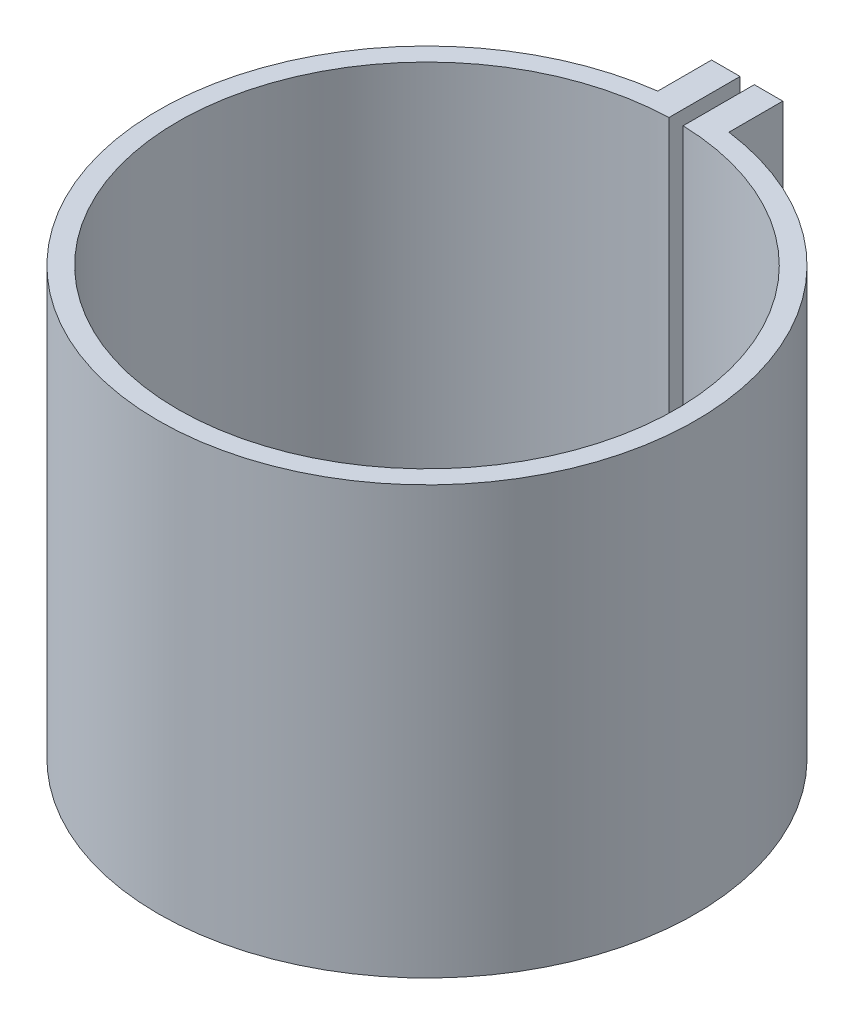
ISO-10303-21;
HEADER;
FILE_DESCRIPTION(('STEP AP214'),'2;1');
FILE_NAME('part.step','',(''),(''),'','','');
FILE_SCHEMA(('AUTOMOTIVE_DESIGN { 1 0 10303 214 1 1 1 1 }'));
ENDSEC;
DATA;
#1=APPLICATION_CONTEXT('core data for automotive mechanical design processes');
#2=APPLICATION_PROTOCOL_DEFINITION('international standard','automotive_design',2000,#1);
#3=PRODUCT_CONTEXT('',#1,'mechanical');
#4=PRODUCT('Part','Part','',(#3));
#5=PRODUCT_RELATED_PRODUCT_CATEGORY('part','',(#4));
#6=PRODUCT_DEFINITION_FORMATION('','',#4);
#7=PRODUCT_DEFINITION_CONTEXT('part definition',#1,'design');
#8=PRODUCT_DEFINITION('design','',#6,#7);
#9=PRODUCT_DEFINITION_SHAPE('','',#8);
#10=(LENGTH_UNIT() NAMED_UNIT(*) SI_UNIT(.MILLI.,.METRE.));
#11=(NAMED_UNIT(*) PLANE_ANGLE_UNIT() SI_UNIT($,.RADIAN.));
#12=(NAMED_UNIT(*) SI_UNIT($,.STERADIAN.) SOLID_ANGLE_UNIT());
#13=UNCERTAINTY_MEASURE_WITH_UNIT(LENGTH_MEASURE(1.E-05),#10,'distance_accuracy_value','');
#14=(GEOMETRIC_REPRESENTATION_CONTEXT(3) GLOBAL_UNCERTAINTY_ASSIGNED_CONTEXT((#13)) GLOBAL_UNIT_ASSIGNED_CONTEXT((#10,
#11,#12)) REPRESENTATION_CONTEXT('',''));
#15=CARTESIAN_POINT('',(0.,0.,0.));
#16=DIRECTION('',(0.,0.,1.));
#17=DIRECTION('',(1.,0.,0.));
#18=AXIS2_PLACEMENT_3D('',#15,#16,#17);
#19=CARTESIAN_POINT('',(0.,15.,0.));
#20=DIRECTION('',(0.,-1.,0.));
#21=DIRECTION('',(0.,0.,-1.));
#22=AXIS2_PLACEMENT_3D('',#19,#20,#21);
#23=CYLINDRICAL_SURFACE('',#22,17.5);
#24=CARTESIAN_POINT('',(0.,-15.,0.));
#25=DIRECTION('',(0.,-1.,0.));
#26=DIRECTION('',(0.,0.,1.));
#27=AXIS2_PLACEMENT_3D('',#24,#25,#26);
#28=CIRCLE('',#27,17.5);
#29=CARTESIAN_POINT('',(0.5,-15.,-17.4928556845359));
#30=VERTEX_POINT('',#29);
#31=CARTESIAN_POINT('',(-0.5,-15.,-17.4928556845359));
#32=VERTEX_POINT('',#31);
#33=EDGE_CURVE('E129',#30,#32,#28,.T.);
#34=ORIENTED_EDGE('',*,*,#33,.T.);
#35=DIRECTION('',(0.,-1.,0.));
#36=VECTOR('',#35,1.);
#37=CARTESIAN_POINT('',(-0.5,15.,-17.4928556845359));
#38=LINE('',#37,#36);
#39=CARTESIAN_POINT('',(-0.5,15.,-17.4928556845359));
#40=VERTEX_POINT('',#39);
#41=EDGE_CURVE('E11',#40,#32,#38,.T.);
#42=ORIENTED_EDGE('',*,*,#41,.F.);
#43=CARTESIAN_POINT('',(0.,15.,0.));
#44=DIRECTION('',(0.,-1.,0.));
#45=DIRECTION('',(0.,0.,1.));
#46=AXIS2_PLACEMENT_3D('',#43,#44,#45);
#47=CIRCLE('',#46,17.5);
#48=CARTESIAN_POINT('',(0.5,15.,-17.4928556845359));
#49=VERTEX_POINT('',#48);
#50=EDGE_CURVE('E143',#49,#40,#47,.T.);
#51=ORIENTED_EDGE('',*,*,#50,.F.);
#52=DIRECTION('',(0.,-1.,0.));
#53=VECTOR('',#52,1.);
#54=CARTESIAN_POINT('',(0.5,15.,-17.4928556845359));
#55=LINE('',#54,#53);
#56=EDGE_CURVE('E125',#49,#30,#55,.T.);
#57=ORIENTED_EDGE('',*,*,#56,.T.);
#58=EDGE_LOOP('',(#34,#42,#51,#57));
#59=FACE_BOUND('',#58,.T.);
#60=ADVANCED_FACE('F33',(#59),#23,.F.);
#61=CARTESIAN_POINT('',(-0.5,15.,-22.4928556845359));
#62=DIRECTION('',(-1.,0.,0.));
#63=DIRECTION('',(0.,0.,1.));
#64=AXIS2_PLACEMENT_3D('',#61,#62,#63);
#65=PLANE('',#64);
#66=DIRECTION('',(0.,0.,-1.));
#67=VECTOR('',#66,1.);
#68=CARTESIAN_POINT('',(-0.5,-15.,-22.4928556845359));
#69=LINE('',#68,#67);
#70=CARTESIAN_POINT('',(-0.5,-15.,-22.4928556845359));
#71=VERTEX_POINT('',#70);
#72=EDGE_CURVE('E132',#32,#71,#69,.T.);
#73=ORIENTED_EDGE('',*,*,#72,.T.);
#74=DIRECTION('',(0.,-1.,0.));
#75=VECTOR('',#74,1.);
#76=CARTESIAN_POINT('',(-0.5,15.,-22.4928556845359));
#77=LINE('',#76,#75);
#78=CARTESIAN_POINT('',(-0.5,15.,-22.4928556845359));
#79=VERTEX_POINT('',#78);
#80=EDGE_CURVE('E41',#79,#71,#77,.T.);
#81=ORIENTED_EDGE('',*,*,#80,.F.);
#82=DIRECTION('',(0.,0.,-1.));
#83=VECTOR('',#82,1.);
#84=CARTESIAN_POINT('',(-0.5,15.,-22.4928556845359));
#85=LINE('',#84,#83);
#86=EDGE_CURVE('E92',#40,#79,#85,.T.);
#87=ORIENTED_EDGE('',*,*,#86,.F.);
#88=ORIENTED_EDGE('',*,*,#41,.T.);
#89=EDGE_LOOP('',(#73,#81,#87,#88));
#90=FACE_BOUND('',#89,.T.);
#91=ADVANCED_FACE('F178',(#90),#65,.F.);
#92=CARTESIAN_POINT('',(-2.5,15.,-22.4928556845359));
#93=DIRECTION('',(0.,0.,1.));
#94=DIRECTION('',(1.,0.,0.));
#95=AXIS2_PLACEMENT_3D('',#92,#93,#94);
#96=PLANE('',#95);
#97=DIRECTION('',(-1.,0.,0.));
#98=VECTOR('',#97,1.);
#99=CARTESIAN_POINT('',(-2.5,-15.,-22.4928556845359));
#100=LINE('',#99,#98);
#101=CARTESIAN_POINT('',(-2.5,-15.,-22.4928556845359));
#102=VERTEX_POINT('',#101);
#103=EDGE_CURVE('E134',#71,#102,#100,.T.);
#104=ORIENTED_EDGE('',*,*,#103,.T.);
#105=DIRECTION('',(0.,-1.,0.));
#106=VECTOR('',#105,1.);
#107=CARTESIAN_POINT('',(-2.5,15.,-22.4928556845359));
#108=LINE('',#107,#106);
#109=CARTESIAN_POINT('',(-2.5,15.,-22.4928556845359));
#110=VERTEX_POINT('',#109);
#111=EDGE_CURVE('E150',#110,#102,#108,.T.);
#112=ORIENTED_EDGE('',*,*,#111,.F.);
#113=DIRECTION('',(-1.,0.,0.));
#114=VECTOR('',#113,1.);
#115=CARTESIAN_POINT('',(-2.5,15.,-22.4928556845359));
#116=LINE('',#115,#114);
#117=EDGE_CURVE('E158',#79,#110,#116,.T.);
#118=ORIENTED_EDGE('',*,*,#117,.F.);
#119=ORIENTED_EDGE('',*,*,#80,.T.);
#120=EDGE_LOOP('',(#104,#112,#118,#119));
#121=FACE_BOUND('',#120,.T.);
#122=ADVANCED_FACE('F156',(#121),#96,.F.);
#123=CARTESIAN_POINT('',(-2.5,15.,-22.4928556845359));
#124=DIRECTION('',(1.,0.,0.));
#125=DIRECTION('',(0.,0.,-1.));
#126=AXIS2_PLACEMENT_3D('',#123,#124,#125);
#127=PLANE('',#126);
#128=DIRECTION('',(0.,0.,1.));
#129=VECTOR('',#128,1.);
#130=CARTESIAN_POINT('',(-2.5,-15.,-22.4928556845359));
#131=LINE('',#130,#129);
#132=CARTESIAN_POINT('',(-2.49999999999999,-15.,-18.7119872578631));
#133=VERTEX_POINT('',#132);
#134=EDGE_CURVE('E136',#102,#133,#131,.T.);
#135=ORIENTED_EDGE('',*,*,#134,.T.);
#136=DIRECTION('',(0.,-1.,0.));
#137=VECTOR('',#136,1.);
#138=CARTESIAN_POINT('',(-2.49999999999999,15.,-18.7119872578631));
#139=LINE('',#138,#137);
#140=CARTESIAN_POINT('',(-2.49999999999999,15.,-18.7119872578631));
#141=VERTEX_POINT('',#140);
#142=EDGE_CURVE('E147',#141,#133,#139,.T.);
#143=ORIENTED_EDGE('',*,*,#142,.F.);
#144=DIRECTION('',(0.,0.,1.));
#145=VECTOR('',#144,1.);
#146=CARTESIAN_POINT('',(-2.5,15.,-22.4928556845359));
#147=LINE('',#146,#145);
#148=EDGE_CURVE('E170',#110,#141,#147,.T.);
#149=ORIENTED_EDGE('',*,*,#148,.F.);
#150=ORIENTED_EDGE('',*,*,#111,.T.);
#151=EDGE_LOOP('',(#135,#143,#149,#150));
#152=FACE_BOUND('',#151,.T.);
#153=ADVANCED_FACE('F166',(#152),#127,.F.);
#154=CARTESIAN_POINT('',(0.,15.,0.));
#155=DIRECTION('',(0.,-1.,0.));
#156=DIRECTION('',(0.,0.,-1.));
#157=AXIS2_PLACEMENT_3D('',#154,#155,#156);
#158=CYLINDRICAL_SURFACE('',#157,18.8782538159236);
#159=CARTESIAN_POINT('',(0.,-15.,0.));
#160=DIRECTION('',(0.,1.,0.));
#161=DIRECTION('',(0.,0.,1.));
#162=AXIS2_PLACEMENT_3D('',#159,#160,#161);
#163=CIRCLE('',#162,18.8782538159236);
#164=CARTESIAN_POINT('',(2.5,-15.,-18.7119872578631));
#165=VERTEX_POINT('',#164);
#166=EDGE_CURVE('E138',#133,#165,#163,.T.);
#167=ORIENTED_EDGE('',*,*,#166,.T.);
#168=DIRECTION('',(0.,-1.,0.));
#169=VECTOR('',#168,1.);
#170=CARTESIAN_POINT('',(2.5,15.,-18.7119872578631));
#171=LINE('',#170,#169);
#172=CARTESIAN_POINT('',(2.5,15.,-18.7119872578631));
#173=VERTEX_POINT('',#172);
#174=EDGE_CURVE('E120',#173,#165,#171,.T.);
#175=ORIENTED_EDGE('',*,*,#174,.F.);
#176=CARTESIAN_POINT('',(0.,15.,0.));
#177=DIRECTION('',(0.,1.,0.));
#178=DIRECTION('',(0.,0.,1.));
#179=AXIS2_PLACEMENT_3D('',#176,#177,#178);
#180=CIRCLE('',#179,18.8782538159236);
#181=EDGE_CURVE('E111',#141,#173,#180,.T.);
#182=ORIENTED_EDGE('',*,*,#181,.F.);
#183=ORIENTED_EDGE('',*,*,#142,.T.);
#184=EDGE_LOOP('',(#167,#175,#182,#183));
#185=FACE_BOUND('',#184,.T.);
#186=ADVANCED_FACE('F169',(#185),#158,.T.);
#187=CARTESIAN_POINT('',(2.5,15.,-22.4928556845359));
#188=DIRECTION('',(-1.,0.,0.));
#189=DIRECTION('',(0.,0.,1.));
#190=AXIS2_PLACEMENT_3D('',#187,#188,#189);
#191=PLANE('',#190);
#192=DIRECTION('',(0.,0.,-1.));
#193=VECTOR('',#192,1.);
#194=CARTESIAN_POINT('',(2.5,-15.,-22.4928556845359));
#195=LINE('',#194,#193);
#196=CARTESIAN_POINT('',(2.5,-15.,-22.4928556845359));
#197=VERTEX_POINT('',#196);
#198=EDGE_CURVE('E119',#165,#197,#195,.T.);
#199=ORIENTED_EDGE('',*,*,#198,.T.);
#200=DIRECTION('',(0.,-1.,0.));
#201=VECTOR('',#200,1.);
#202=CARTESIAN_POINT('',(2.5,15.,-22.4928556845359));
#203=LINE('',#202,#201);
#204=CARTESIAN_POINT('',(2.5,15.,-22.4928556845359));
#205=VERTEX_POINT('',#204);
#206=EDGE_CURVE('E116',#205,#197,#203,.T.);
#207=ORIENTED_EDGE('',*,*,#206,.F.);
#208=DIRECTION('',(0.,0.,-1.));
#209=VECTOR('',#208,1.);
#210=CARTESIAN_POINT('',(2.5,15.,-22.4928556845359));
#211=LINE('',#210,#209);
#212=EDGE_CURVE('E105',#173,#205,#211,.T.);
#213=ORIENTED_EDGE('',*,*,#212,.F.);
#214=ORIENTED_EDGE('',*,*,#174,.T.);
#215=EDGE_LOOP('',(#199,#207,#213,#214));
#216=FACE_BOUND('',#215,.T.);
#217=ADVANCED_FACE('F117',(#216),#191,.F.);
#218=CARTESIAN_POINT('',(2.5,15.,-22.4928556845359));
#219=DIRECTION('',(0.,0.,1.));
#220=DIRECTION('',(1.,0.,0.));
#221=AXIS2_PLACEMENT_3D('',#218,#219,#220);
#222=PLANE('',#221);
#223=DIRECTION('',(-1.,0.,0.));
#224=VECTOR('',#223,1.);
#225=CARTESIAN_POINT('',(2.5,-15.,-22.4928556845359));
#226=LINE('',#225,#224);
#227=CARTESIAN_POINT('',(0.5,-15.,-22.4928556845359));
#228=VERTEX_POINT('',#227);
#229=EDGE_CURVE('E78',#197,#228,#226,.T.);
#230=ORIENTED_EDGE('',*,*,#229,.T.);
#231=DIRECTION('',(0.,-1.,0.));
#232=VECTOR('',#231,1.);
#233=CARTESIAN_POINT('',(0.5,15.,-22.4928556845359));
#234=LINE('',#233,#232);
#235=CARTESIAN_POINT('',(0.5,15.,-22.4928556845359));
#236=VERTEX_POINT('',#235);
#237=EDGE_CURVE('E121',#236,#228,#234,.T.);
#238=ORIENTED_EDGE('',*,*,#237,.F.);
#239=DIRECTION('',(-1.,0.,0.));
#240=VECTOR('',#239,1.);
#241=CARTESIAN_POINT('',(2.5,15.,-22.4928556845359));
#242=LINE('',#241,#240);
#243=EDGE_CURVE('E109',#205,#236,#242,.T.);
#244=ORIENTED_EDGE('',*,*,#243,.F.);
#245=ORIENTED_EDGE('',*,*,#206,.T.);
#246=EDGE_LOOP('',(#230,#238,#244,#245));
#247=FACE_BOUND('',#246,.T.);
#248=ADVANCED_FACE('F123',(#247),#222,.F.);
#249=CARTESIAN_POINT('',(0.5,15.,-22.4928556845359));
#250=DIRECTION('',(1.,0.,0.));
#251=DIRECTION('',(0.,0.,-1.));
#252=AXIS2_PLACEMENT_3D('',#249,#250,#251);
#253=PLANE('',#252);
#254=DIRECTION('',(0.,0.,1.));
#255=VECTOR('',#254,1.);
#256=CARTESIAN_POINT('',(0.5,-15.,-22.4928556845359));
#257=LINE('',#256,#255);
#258=EDGE_CURVE('E84',#228,#30,#257,.T.);
#259=ORIENTED_EDGE('',*,*,#258,.T.);
#260=ORIENTED_EDGE('',*,*,#56,.F.);
#261=DIRECTION('',(0.,0.,1.));
#262=VECTOR('',#261,1.);
#263=CARTESIAN_POINT('',(0.5,15.,-22.4928556845359));
#264=LINE('',#263,#262);
#265=EDGE_CURVE('E49',#236,#49,#264,.T.);
#266=ORIENTED_EDGE('',*,*,#265,.F.);
#267=ORIENTED_EDGE('',*,*,#237,.T.);
#268=EDGE_LOOP('',(#259,#260,#266,#267));
#269=FACE_BOUND('',#268,.T.);
#270=ADVANCED_FACE('F194',(#269),#253,.F.);
#271=CARTESIAN_POINT('',(0.,15.,0.));
#272=DIRECTION('',(0.,1.,0.));
#273=DIRECTION('',(0.,0.,1.));
#274=AXIS2_PLACEMENT_3D('',#271,#272,#273);
#275=PLANE('',#274);
#276=ORIENTED_EDGE('',*,*,#50,.T.);
#277=ORIENTED_EDGE('',*,*,#86,.T.);
#278=ORIENTED_EDGE('',*,*,#117,.T.);
#279=ORIENTED_EDGE('',*,*,#148,.T.);
#280=ORIENTED_EDGE('',*,*,#181,.T.);
#281=ORIENTED_EDGE('',*,*,#212,.T.);
#282=ORIENTED_EDGE('',*,*,#243,.T.);
#283=ORIENTED_EDGE('',*,*,#265,.T.);
#284=EDGE_LOOP('',(#276,#277,#278,#279,#280,#281,#282,#283));
#285=FACE_BOUND('',#284,.T.);
#286=ADVANCED_FACE('F107',(#285),#275,.T.);
#287=CARTESIAN_POINT('',(0.,-15.,0.));
#288=DIRECTION('',(0.,1.,0.));
#289=DIRECTION('',(0.,0.,1.));
#290=AXIS2_PLACEMENT_3D('',#287,#288,#289);
#291=PLANE('',#290);
#292=ORIENTED_EDGE('',*,*,#33,.F.);
#293=ORIENTED_EDGE('',*,*,#258,.F.);
#294=ORIENTED_EDGE('',*,*,#229,.F.);
#295=ORIENTED_EDGE('',*,*,#198,.F.);
#296=ORIENTED_EDGE('',*,*,#166,.F.);
#297=ORIENTED_EDGE('',*,*,#134,.F.);
#298=ORIENTED_EDGE('',*,*,#103,.F.);
#299=ORIENTED_EDGE('',*,*,#72,.F.);
#300=EDGE_LOOP('',(#292,#293,#294,#295,#296,#297,#298,#299));
#301=FACE_BOUND('',#300,.T.);
#302=ADVANCED_FACE('F162',(#301),#291,.F.);
#303=CLOSED_SHELL('',(#60,#91,#122,#153,#186,#217,#248,#270,#286,#302));
#304=MANIFOLD_SOLID_BREP('B2',#303);
#305=ADVANCED_BREP_SHAPE_REPRESENTATION('',(#18,#304),#14);
#306=SHAPE_DEFINITION_REPRESENTATION(#9,#305);
ENDSEC;
END-ISO-10303-21;
